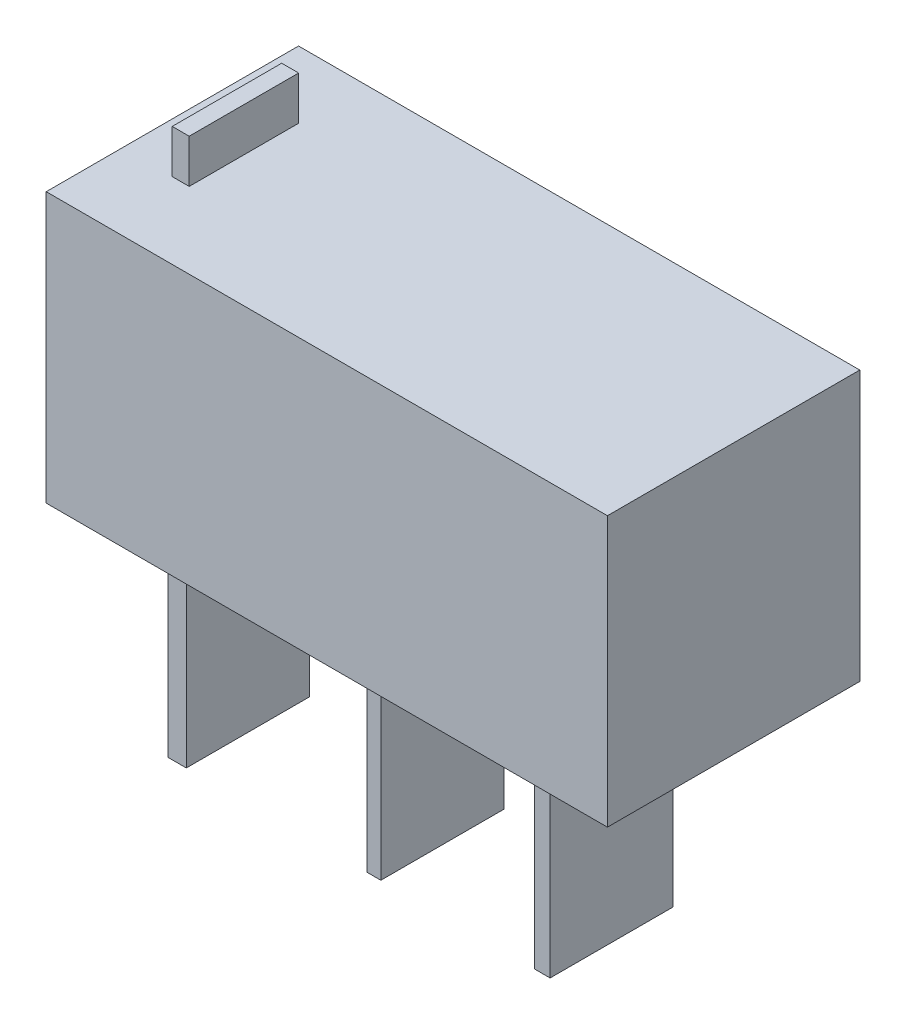
ISO-10303-21;
HEADER;
FILE_DESCRIPTION(('STEP AP214'),'2;1');
FILE_NAME('part.step','',(''),(''),'','','');
FILE_SCHEMA(('AUTOMOTIVE_DESIGN { 1 0 10303 214 1 1 1 1 }'));
ENDSEC;
DATA;
#1=APPLICATION_CONTEXT('core data for automotive mechanical design processes');
#2=APPLICATION_PROTOCOL_DEFINITION('international standard','automotive_design',2000,#1);
#3=PRODUCT_CONTEXT('',#1,'mechanical');
#4=PRODUCT('Part','Part','',(#3));
#5=PRODUCT_RELATED_PRODUCT_CATEGORY('part','',(#4));
#6=PRODUCT_DEFINITION_FORMATION('','',#4);
#7=PRODUCT_DEFINITION_CONTEXT('part definition',#1,'design');
#8=PRODUCT_DEFINITION('design','',#6,#7);
#9=PRODUCT_DEFINITION_SHAPE('','',#8);
#10=(LENGTH_UNIT() NAMED_UNIT(*) SI_UNIT(.MILLI.,.METRE.));
#11=(NAMED_UNIT(*) PLANE_ANGLE_UNIT() SI_UNIT($,.RADIAN.));
#12=(NAMED_UNIT(*) SI_UNIT($,.STERADIAN.) SOLID_ANGLE_UNIT());
#13=UNCERTAINTY_MEASURE_WITH_UNIT(LENGTH_MEASURE(1.E-05),#10,'distance_accuracy_value','');
#14=(GEOMETRIC_REPRESENTATION_CONTEXT(3) GLOBAL_UNCERTAINTY_ASSIGNED_CONTEXT((#13)) GLOBAL_UNIT_ASSIGNED_CONTEXT((#10,
#11,#12)) REPRESENTATION_CONTEXT('',''));
#15=CARTESIAN_POINT('',(0.,0.,0.));
#16=DIRECTION('',(0.,0.,1.));
#17=DIRECTION('',(1.,0.,0.));
#18=AXIS2_PLACEMENT_3D('',#15,#16,#17);
#19=CARTESIAN_POINT('',(0.,0.,0.));
#20=DIRECTION('',(0.,1.,0.));
#21=DIRECTION('',(0.,0.,1.));
#22=AXIS2_PLACEMENT_3D('',#19,#20,#21);
#23=PLANE('',#22);
#24=DIRECTION('',(0.,0.,-1.));
#25=VECTOR('',#24,1.);
#26=CARTESIAN_POINT('',(6.03634542390807,0.,1.63578847152124));
#27=LINE('',#26,#25);
#28=CARTESIAN_POINT('',(6.03634542390807,0.,4.46159278029512));
#29=VERTEX_POINT('',#28);
#30=CARTESIAN_POINT('',(6.03634542390807,0.,1.63578847152124));
#31=VERTEX_POINT('',#30);
#32=EDGE_CURVE('E191',#29,#31,#27,.T.);
#33=ORIENTED_EDGE('',*,*,#32,.F.);
#34=DIRECTION('',(-1.,0.,0.));
#35=VECTOR('',#34,1.);
#36=CARTESIAN_POINT('',(6.03634542390807,0.,4.46159278029512));
#37=LINE('',#36,#35);
#38=CARTESIAN_POINT('',(6.35316918746298,0.,4.46159278029512));
#39=VERTEX_POINT('',#38);
#40=EDGE_CURVE('E204',#39,#29,#37,.T.);
#41=ORIENTED_EDGE('',*,*,#40,.F.);
#42=DIRECTION('',(0.,0.,1.));
#43=VECTOR('',#42,1.);
#44=CARTESIAN_POINT('',(6.35316918746298,0.,1.63578847152124));
#45=LINE('',#44,#43);
#46=CARTESIAN_POINT('',(6.35316918746298,0.,1.63578847152124));
#47=VERTEX_POINT('',#46);
#48=EDGE_CURVE('E213',#47,#39,#45,.T.);
#49=ORIENTED_EDGE('',*,*,#48,.F.);
#50=DIRECTION('',(1.,0.,0.));
#51=VECTOR('',#50,1.);
#52=CARTESIAN_POINT('',(6.03634542390807,0.,1.63578847152124));
#53=LINE('',#52,#51);
#54=EDGE_CURVE('E194',#31,#47,#53,.T.);
#55=ORIENTED_EDGE('',*,*,#54,.F.);
#56=EDGE_LOOP('',(#33,#41,#49,#55));
#57=FACE_BOUND('',#56,.T.);
#58=DIRECTION('',(0.,0.,1.));
#59=VECTOR('',#58,1.);
#60=CARTESIAN_POINT('',(0.,0.,0.));
#61=LINE('',#60,#59);
#62=CARTESIAN_POINT('',(0.,0.,0.));
#63=VERTEX_POINT('',#62);
#64=CARTESIAN_POINT('',(0.,0.,5.8));
#65=VERTEX_POINT('',#64);
#66=EDGE_CURVE('E291',#63,#65,#61,.T.);
#67=ORIENTED_EDGE('',*,*,#66,.F.);
#68=DIRECTION('',(-1.,0.,0.));
#69=VECTOR('',#68,1.);
#70=CARTESIAN_POINT('',(0.,0.,0.));
#71=LINE('',#70,#69);
#72=CARTESIAN_POINT('',(12.9,0.,0.));
#73=VERTEX_POINT('',#72);
#74=EDGE_CURVE('E296',#73,#63,#71,.T.);
#75=ORIENTED_EDGE('',*,*,#74,.F.);
#76=DIRECTION('',(0.,0.,-1.));
#77=VECTOR('',#76,1.);
#78=CARTESIAN_POINT('',(12.9,0.,0.));
#79=LINE('',#78,#77);
#80=CARTESIAN_POINT('',(12.9,0.,5.8));
#81=VERTEX_POINT('',#80);
#82=EDGE_CURVE('E307',#81,#73,#79,.T.);
#83=ORIENTED_EDGE('',*,*,#82,.F.);
#84=DIRECTION('',(1.,0.,0.));
#85=VECTOR('',#84,1.);
#86=CARTESIAN_POINT('',(0.,0.,5.8));
#87=LINE('',#86,#85);
#88=EDGE_CURVE('E305',#65,#81,#87,.T.);
#89=ORIENTED_EDGE('',*,*,#88,.F.);
#90=EDGE_LOOP('',(#67,#75,#83,#89));
#91=FACE_BOUND('',#90,.T.);
#92=DIRECTION('',(0.,0.,-1.));
#93=VECTOR('',#92,1.);
#94=CARTESIAN_POINT('',(1.46413027871972,0.,1.63578847152124));
#95=LINE('',#94,#93);
#96=CARTESIAN_POINT('',(1.46413027871972,0.,4.46159278029512));
#97=VERTEX_POINT('',#96);
#98=CARTESIAN_POINT('',(1.46413027871972,0.,1.63578847152124));
#99=VERTEX_POINT('',#98);
#100=EDGE_CURVE('E229',#97,#99,#95,.T.);
#101=ORIENTED_EDGE('',*,*,#100,.F.);
#102=DIRECTION('',(-1.,0.,0.));
#103=VECTOR('',#102,1.);
#104=CARTESIAN_POINT('',(1.46413027871972,0.,4.46159278029512));
#105=LINE('',#104,#103);
#106=CARTESIAN_POINT('',(1.88198429378872,0.,4.46159278029512));
#107=VERTEX_POINT('',#106);
#108=EDGE_CURVE('E234',#107,#97,#105,.T.);
#109=ORIENTED_EDGE('',*,*,#108,.F.);
#110=DIRECTION('',(0.,0.,1.));
#111=VECTOR('',#110,1.);
#112=CARTESIAN_POINT('',(1.88198429378872,0.,1.63578847152124));
#113=LINE('',#112,#111);
#114=CARTESIAN_POINT('',(1.88198429378872,0.,1.63578847152124));
#115=VERTEX_POINT('',#114);
#116=EDGE_CURVE('E246',#115,#107,#113,.T.);
#117=ORIENTED_EDGE('',*,*,#116,.F.);
#118=DIRECTION('',(1.,0.,0.));
#119=VECTOR('',#118,1.);
#120=CARTESIAN_POINT('',(1.46413027871972,0.,1.63578847152124));
#121=LINE('',#120,#119);
#122=EDGE_CURVE('E243',#99,#115,#121,.T.);
#123=ORIENTED_EDGE('',*,*,#122,.F.);
#124=EDGE_LOOP('',(#101,#109,#117,#123));
#125=FACE_BOUND('',#124,.T.);
#126=DIRECTION('',(0.,0.,-1.));
#127=VECTOR('',#126,1.);
#128=CARTESIAN_POINT('',(9.88671330269142,0.,1.63578847152124));
#129=LINE('',#128,#127);
#130=CARTESIAN_POINT('',(9.88671330269142,0.,4.46159278029512));
#131=VERTEX_POINT('',#130);
#132=CARTESIAN_POINT('',(9.88671330269142,0.,1.63578847152124));
#133=VERTEX_POINT('',#132);
#134=EDGE_CURVE('E190',#131,#133,#129,.T.);
#135=ORIENTED_EDGE('',*,*,#134,.F.);
#136=DIRECTION('',(-1.,0.,0.));
#137=VECTOR('',#136,1.);
#138=CARTESIAN_POINT('',(9.88671330269142,0.,4.46159278029512));
#139=LINE('',#138,#137);
#140=CARTESIAN_POINT('',(10.2436396921348,0.,4.46159278029512));
#141=VERTEX_POINT('',#140);
#142=EDGE_CURVE('E187',#141,#131,#139,.T.);
#143=ORIENTED_EDGE('',*,*,#142,.F.);
#144=DIRECTION('',(0.,0.,1.));
#145=VECTOR('',#144,1.);
#146=CARTESIAN_POINT('',(10.2436396921348,0.,1.63578847152124));
#147=LINE('',#146,#145);
#148=CARTESIAN_POINT('',(10.2436396921348,0.,1.63578847152124));
#149=VERTEX_POINT('',#148);
#150=EDGE_CURVE('E53',#149,#141,#147,.T.);
#151=ORIENTED_EDGE('',*,*,#150,.F.);
#152=DIRECTION('',(1.,0.,0.));
#153=VECTOR('',#152,1.);
#154=CARTESIAN_POINT('',(9.88671330269142,0.,1.63578847152124));
#155=LINE('',#154,#153);
#156=EDGE_CURVE('E48',#133,#149,#155,.T.);
#157=ORIENTED_EDGE('',*,*,#156,.F.);
#158=EDGE_LOOP('',(#135,#143,#151,#157));
#159=FACE_BOUND('',#158,.T.);
#160=ADVANCED_FACE('F33',(#57,#91,#125,#159),#23,.F.);
#161=CARTESIAN_POINT('',(0.,6.2,0.));
#162=DIRECTION('',(0.,1.,0.));
#163=DIRECTION('',(0.,0.,1.));
#164=AXIS2_PLACEMENT_3D('',#161,#162,#163);
#165=PLANE('',#164);
#166=DIRECTION('',(0.,0.,1.));
#167=VECTOR('',#166,1.);
#168=CARTESIAN_POINT('',(0.,6.2,0.));
#169=LINE('',#168,#167);
#170=CARTESIAN_POINT('',(0.,6.2,0.));
#171=VERTEX_POINT('',#170);
#172=CARTESIAN_POINT('',(0.,6.2,5.8));
#173=VERTEX_POINT('',#172);
#174=EDGE_CURVE('E292',#171,#173,#169,.T.);
#175=ORIENTED_EDGE('',*,*,#174,.T.);
#176=DIRECTION('',(1.,0.,0.));
#177=VECTOR('',#176,1.);
#178=CARTESIAN_POINT('',(0.,6.2,5.8));
#179=LINE('',#178,#177);
#180=CARTESIAN_POINT('',(12.9,6.2,5.8));
#181=VERTEX_POINT('',#180);
#182=EDGE_CURVE('E295',#173,#181,#179,.T.);
#183=ORIENTED_EDGE('',*,*,#182,.T.);
#184=DIRECTION('',(0.,0.,-1.));
#185=VECTOR('',#184,1.);
#186=CARTESIAN_POINT('',(12.9,6.2,0.));
#187=LINE('',#186,#185);
#188=CARTESIAN_POINT('',(12.9,6.2,0.));
#189=VERTEX_POINT('',#188);
#190=EDGE_CURVE('E298',#181,#189,#187,.T.);
#191=ORIENTED_EDGE('',*,*,#190,.T.);
#192=DIRECTION('',(-1.,0.,0.));
#193=VECTOR('',#192,1.);
#194=CARTESIAN_POINT('',(0.,6.2,0.));
#195=LINE('',#194,#193);
#196=EDGE_CURVE('E300',#189,#171,#195,.T.);
#197=ORIENTED_EDGE('',*,*,#196,.T.);
#198=EDGE_LOOP('',(#175,#183,#191,#197));
#199=FACE_BOUND('',#198,.T.);
#200=DIRECTION('',(1.,0.,0.));
#201=VECTOR('',#200,1.);
#202=CARTESIAN_POINT('',(1.1486061016388,6.2,4.05212414358402));
#203=LINE('',#202,#201);
#204=CARTESIAN_POINT('',(1.1486061016388,6.2,4.05212414358402));
#205=VERTEX_POINT('',#204);
#206=CARTESIAN_POINT('',(1.53858311466593,6.2,4.05212414358402));
#207=VERTEX_POINT('',#206);
#208=EDGE_CURVE('E276',#205,#207,#203,.T.);
#209=ORIENTED_EDGE('',*,*,#208,.F.);
#210=DIRECTION('',(0.,0.,1.));
#211=VECTOR('',#210,1.);
#212=CARTESIAN_POINT('',(1.1486061016388,6.2,1.53622734069359));
#213=LINE('',#212,#211);
#214=CARTESIAN_POINT('',(1.1486061016388,6.2,1.53622734069359));
#215=VERTEX_POINT('',#214);
#216=EDGE_CURVE('E262',#215,#205,#213,.T.);
#217=ORIENTED_EDGE('',*,*,#216,.F.);
#218=DIRECTION('',(-1.,0.,0.));
#219=VECTOR('',#218,1.);
#220=CARTESIAN_POINT('',(1.1486061016388,6.2,1.53622734069359));
#221=LINE('',#220,#219);
#222=CARTESIAN_POINT('',(1.53858311466593,6.2,1.53622734069359));
#223=VERTEX_POINT('',#222);
#224=EDGE_CURVE('E267',#223,#215,#221,.T.);
#225=ORIENTED_EDGE('',*,*,#224,.F.);
#226=DIRECTION('',(0.,0.,-1.));
#227=VECTOR('',#226,1.);
#228=CARTESIAN_POINT('',(1.53858311466593,6.2,1.53622734069359));
#229=LINE('',#228,#227);
#230=EDGE_CURVE('E278',#207,#223,#229,.T.);
#231=ORIENTED_EDGE('',*,*,#230,.F.);
#232=EDGE_LOOP('',(#209,#217,#225,#231));
#233=FACE_BOUND('',#232,.T.);
#234=ADVANCED_FACE('F334',(#199,#233),#165,.T.);
#235=CARTESIAN_POINT('',(0.,6.2,0.));
#236=DIRECTION('',(1.,0.,0.));
#237=DIRECTION('',(0.,0.,-1.));
#238=AXIS2_PLACEMENT_3D('',#235,#236,#237);
#239=PLANE('',#238);
#240=ORIENTED_EDGE('',*,*,#66,.T.);
#241=DIRECTION('',(0.,-1.,0.));
#242=VECTOR('',#241,1.);
#243=CARTESIAN_POINT('',(0.,6.2,5.8));
#244=LINE('',#243,#242);
#245=EDGE_CURVE('E11',#173,#65,#244,.T.);
#246=ORIENTED_EDGE('',*,*,#245,.F.);
#247=ORIENTED_EDGE('',*,*,#174,.F.);
#248=DIRECTION('',(0.,-1.,0.));
#249=VECTOR('',#248,1.);
#250=CARTESIAN_POINT('',(0.,6.2,0.));
#251=LINE('',#250,#249);
#252=EDGE_CURVE('E302',#171,#63,#251,.T.);
#253=ORIENTED_EDGE('',*,*,#252,.T.);
#254=EDGE_LOOP('',(#240,#246,#247,#253));
#255=FACE_BOUND('',#254,.T.);
#256=ADVANCED_FACE('F35',(#255),#239,.F.);
#257=CARTESIAN_POINT('',(0.,6.2,5.8));
#258=DIRECTION('',(0.,0.,-1.));
#259=DIRECTION('',(-1.,0.,0.));
#260=AXIS2_PLACEMENT_3D('',#257,#258,#259);
#261=PLANE('',#260);
#262=ORIENTED_EDGE('',*,*,#88,.T.);
#263=DIRECTION('',(0.,-1.,0.));
#264=VECTOR('',#263,1.);
#265=CARTESIAN_POINT('',(12.9,6.2,5.8));
#266=LINE('',#265,#264);
#267=EDGE_CURVE('E41',#181,#81,#266,.T.);
#268=ORIENTED_EDGE('',*,*,#267,.F.);
#269=ORIENTED_EDGE('',*,*,#182,.F.);
#270=ORIENTED_EDGE('',*,*,#245,.T.);
#271=EDGE_LOOP('',(#262,#268,#269,#270));
#272=FACE_BOUND('',#271,.T.);
#273=ADVANCED_FACE('F336',(#272),#261,.F.);
#274=CARTESIAN_POINT('',(12.9,6.2,0.));
#275=DIRECTION('',(-1.,0.,0.));
#276=DIRECTION('',(0.,0.,1.));
#277=AXIS2_PLACEMENT_3D('',#274,#275,#276);
#278=PLANE('',#277);
#279=ORIENTED_EDGE('',*,*,#82,.T.);
#280=DIRECTION('',(0.,-1.,0.));
#281=VECTOR('',#280,1.);
#282=CARTESIAN_POINT('',(12.9,6.2,0.));
#283=LINE('',#282,#281);
#284=EDGE_CURVE('E312',#189,#73,#283,.T.);
#285=ORIENTED_EDGE('',*,*,#284,.F.);
#286=ORIENTED_EDGE('',*,*,#190,.F.);
#287=ORIENTED_EDGE('',*,*,#267,.T.);
#288=EDGE_LOOP('',(#279,#285,#286,#287));
#289=FACE_BOUND('',#288,.T.);
#290=ADVANCED_FACE('F319',(#289),#278,.F.);
#291=CARTESIAN_POINT('',(0.,6.2,0.));
#292=DIRECTION('',(0.,0.,1.));
#293=DIRECTION('',(1.,0.,0.));
#294=AXIS2_PLACEMENT_3D('',#291,#292,#293);
#295=PLANE('',#294);
#296=ORIENTED_EDGE('',*,*,#74,.T.);
#297=ORIENTED_EDGE('',*,*,#252,.F.);
#298=ORIENTED_EDGE('',*,*,#196,.F.);
#299=ORIENTED_EDGE('',*,*,#284,.T.);
#300=EDGE_LOOP('',(#296,#297,#298,#299));
#301=FACE_BOUND('',#300,.T.);
#302=ADVANCED_FACE('F328',(#301),#295,.F.);
#303=CARTESIAN_POINT('',(1.1486061016388,7.2,1.53622734069359));
#304=DIRECTION('',(1.,0.,0.));
#305=DIRECTION('',(0.,0.,-1.));
#306=AXIS2_PLACEMENT_3D('',#303,#304,#305);
#307=PLANE('',#306);
#308=ORIENTED_EDGE('',*,*,#216,.T.);
#309=DIRECTION('',(0.,-1.,0.));
#310=VECTOR('',#309,1.);
#311=CARTESIAN_POINT('',(1.1486061016388,7.2,4.05212414358402));
#312=LINE('',#311,#310);
#313=CARTESIAN_POINT('',(1.1486061016388,7.2,4.05212414358402));
#314=VERTEX_POINT('',#313);
#315=EDGE_CURVE('E289',#314,#205,#312,.T.);
#316=ORIENTED_EDGE('',*,*,#315,.F.);
#317=DIRECTION('',(0.,0.,1.));
#318=VECTOR('',#317,1.);
#319=CARTESIAN_POINT('',(1.1486061016388,7.2,1.53622734069359));
#320=LINE('',#319,#318);
#321=CARTESIAN_POINT('',(1.1486061016388,7.2,1.53622734069359));
#322=VERTEX_POINT('',#321);
#323=EDGE_CURVE('E263',#322,#314,#320,.T.);
#324=ORIENTED_EDGE('',*,*,#323,.F.);
#325=DIRECTION('',(0.,-1.,0.));
#326=VECTOR('',#325,1.);
#327=CARTESIAN_POINT('',(1.1486061016388,7.2,1.53622734069359));
#328=LINE('',#327,#326);
#329=EDGE_CURVE('E273',#322,#215,#328,.T.);
#330=ORIENTED_EDGE('',*,*,#329,.T.);
#331=EDGE_LOOP('',(#308,#316,#324,#330));
#332=FACE_BOUND('',#331,.T.);
#333=ADVANCED_FACE('F353',(#332),#307,.F.);
#334=CARTESIAN_POINT('',(1.1486061016388,7.2,4.05212414358402));
#335=DIRECTION('',(0.,0.,-1.));
#336=DIRECTION('',(-1.,0.,0.));
#337=AXIS2_PLACEMENT_3D('',#334,#335,#336);
#338=PLANE('',#337);
#339=ORIENTED_EDGE('',*,*,#208,.T.);
#340=DIRECTION('',(0.,-1.,0.));
#341=VECTOR('',#340,1.);
#342=CARTESIAN_POINT('',(1.53858311466593,7.2,4.05212414358402));
#343=LINE('',#342,#341);
#344=CARTESIAN_POINT('',(1.53858311466593,7.2,4.05212414358402));
#345=VERTEX_POINT('',#344);
#346=EDGE_CURVE('E286',#345,#207,#343,.T.);
#347=ORIENTED_EDGE('',*,*,#346,.F.);
#348=DIRECTION('',(1.,0.,0.));
#349=VECTOR('',#348,1.);
#350=CARTESIAN_POINT('',(1.1486061016388,7.2,4.05212414358402));
#351=LINE('',#350,#349);
#352=EDGE_CURVE('E266',#314,#345,#351,.T.);
#353=ORIENTED_EDGE('',*,*,#352,.F.);
#354=ORIENTED_EDGE('',*,*,#315,.T.);
#355=EDGE_LOOP('',(#339,#347,#353,#354));
#356=FACE_BOUND('',#355,.T.);
#357=ADVANCED_FACE('F357',(#356),#338,.F.);
#358=CARTESIAN_POINT('',(1.53858311466593,7.2,1.53622734069359));
#359=DIRECTION('',(-1.,0.,0.));
#360=DIRECTION('',(0.,0.,1.));
#361=AXIS2_PLACEMENT_3D('',#358,#359,#360);
#362=PLANE('',#361);
#363=ORIENTED_EDGE('',*,*,#230,.T.);
#364=DIRECTION('',(0.,-1.,0.));
#365=VECTOR('',#364,1.);
#366=CARTESIAN_POINT('',(1.53858311466593,7.2,1.53622734069359));
#367=LINE('',#366,#365);
#368=CARTESIAN_POINT('',(1.53858311466593,7.2,1.53622734069359));
#369=VERTEX_POINT('',#368);
#370=EDGE_CURVE('E284',#369,#223,#367,.T.);
#371=ORIENTED_EDGE('',*,*,#370,.F.);
#372=DIRECTION('',(0.,0.,-1.));
#373=VECTOR('',#372,1.);
#374=CARTESIAN_POINT('',(1.53858311466593,7.2,1.53622734069359));
#375=LINE('',#374,#373);
#376=EDGE_CURVE('E269',#345,#369,#375,.T.);
#377=ORIENTED_EDGE('',*,*,#376,.F.);
#378=ORIENTED_EDGE('',*,*,#346,.T.);
#379=EDGE_LOOP('',(#363,#371,#377,#378));
#380=FACE_BOUND('',#379,.T.);
#381=ADVANCED_FACE('F362',(#380),#362,.F.);
#382=CARTESIAN_POINT('',(1.1486061016388,7.2,1.53622734069359));
#383=DIRECTION('',(0.,0.,1.));
#384=DIRECTION('',(1.,0.,0.));
#385=AXIS2_PLACEMENT_3D('',#382,#383,#384);
#386=PLANE('',#385);
#387=ORIENTED_EDGE('',*,*,#224,.T.);
#388=ORIENTED_EDGE('',*,*,#329,.F.);
#389=DIRECTION('',(-1.,0.,0.));
#390=VECTOR('',#389,1.);
#391=CARTESIAN_POINT('',(1.1486061016388,7.2,1.53622734069359));
#392=LINE('',#391,#390);
#393=EDGE_CURVE('E271',#369,#322,#392,.T.);
#394=ORIENTED_EDGE('',*,*,#393,.F.);
#395=ORIENTED_EDGE('',*,*,#370,.T.);
#396=EDGE_LOOP('',(#387,#388,#394,#395));
#397=FACE_BOUND('',#396,.T.);
#398=ADVANCED_FACE('F368',(#397),#386,.F.);
#399=CARTESIAN_POINT('',(0.,7.2,0.));
#400=DIRECTION('',(0.,1.,0.));
#401=DIRECTION('',(0.,0.,1.));
#402=AXIS2_PLACEMENT_3D('',#399,#400,#401);
#403=PLANE('',#402);
#404=ORIENTED_EDGE('',*,*,#323,.T.);
#405=ORIENTED_EDGE('',*,*,#352,.T.);
#406=ORIENTED_EDGE('',*,*,#376,.T.);
#407=ORIENTED_EDGE('',*,*,#393,.T.);
#408=EDGE_LOOP('',(#404,#405,#406,#407));
#409=FACE_BOUND('',#408,.T.);
#410=ADVANCED_FACE('F372',(#409),#403,.T.);
#411=CARTESIAN_POINT('',(1.46413027871972,-5.,1.63578847152124));
#412=DIRECTION('',(1.,0.,0.));
#413=DIRECTION('',(0.,0.,-1.));
#414=AXIS2_PLACEMENT_3D('',#411,#412,#413);
#415=PLANE('',#414);
#416=ORIENTED_EDGE('',*,*,#100,.T.);
#417=DIRECTION('',(0.,1.,0.));
#418=VECTOR('',#417,1.);
#419=CARTESIAN_POINT('',(1.46413027871972,-5.,1.63578847152124));
#420=LINE('',#419,#418);
#421=CARTESIAN_POINT('',(1.46413027871972,-5.,1.63578847152124));
#422=VERTEX_POINT('',#421);
#423=EDGE_CURVE('E259',#422,#99,#420,.T.);
#424=ORIENTED_EDGE('',*,*,#423,.F.);
#425=DIRECTION('',(0.,0.,-1.));
#426=VECTOR('',#425,1.);
#427=CARTESIAN_POINT('',(1.46413027871972,-5.,1.63578847152124));
#428=LINE('',#427,#426);
#429=CARTESIAN_POINT('',(1.46413027871972,-5.,4.46159278029512));
#430=VERTEX_POINT('',#429);
#431=EDGE_CURVE('E230',#430,#422,#428,.T.);
#432=ORIENTED_EDGE('',*,*,#431,.F.);
#433=DIRECTION('',(0.,1.,0.));
#434=VECTOR('',#433,1.);
#435=CARTESIAN_POINT('',(1.46413027871972,-5.,4.46159278029512));
#436=LINE('',#435,#434);
#437=EDGE_CURVE('E240',#430,#97,#436,.T.);
#438=ORIENTED_EDGE('',*,*,#437,.T.);
#439=EDGE_LOOP('',(#416,#424,#432,#438));
#440=FACE_BOUND('',#439,.T.);
#441=ADVANCED_FACE('F376',(#440),#415,.F.);
#442=CARTESIAN_POINT('',(1.46413027871972,-5.,1.63578847152124));
#443=DIRECTION('',(0.,0.,1.));
#444=DIRECTION('',(1.,0.,0.));
#445=AXIS2_PLACEMENT_3D('',#442,#443,#444);
#446=PLANE('',#445);
#447=ORIENTED_EDGE('',*,*,#122,.T.);
#448=DIRECTION('',(0.,1.,0.));
#449=VECTOR('',#448,1.);
#450=CARTESIAN_POINT('',(1.88198429378872,-5.,1.63578847152124));
#451=LINE('',#450,#449);
#452=CARTESIAN_POINT('',(1.88198429378872,-5.,1.63578847152124));
#453=VERTEX_POINT('',#452);
#454=EDGE_CURVE('E256',#453,#115,#451,.T.);
#455=ORIENTED_EDGE('',*,*,#454,.F.);
#456=DIRECTION('',(1.,0.,0.));
#457=VECTOR('',#456,1.);
#458=CARTESIAN_POINT('',(1.46413027871972,-5.,1.63578847152124));
#459=LINE('',#458,#457);
#460=EDGE_CURVE('E233',#422,#453,#459,.T.);
#461=ORIENTED_EDGE('',*,*,#460,.F.);
#462=ORIENTED_EDGE('',*,*,#423,.T.);
#463=EDGE_LOOP('',(#447,#455,#461,#462));
#464=FACE_BOUND('',#463,.T.);
#465=ADVANCED_FACE('F380',(#464),#446,.F.);
#466=CARTESIAN_POINT('',(1.88198429378872,-5.,1.63578847152124));
#467=DIRECTION('',(-1.,0.,0.));
#468=DIRECTION('',(0.,0.,1.));
#469=AXIS2_PLACEMENT_3D('',#466,#467,#468);
#470=PLANE('',#469);
#471=ORIENTED_EDGE('',*,*,#116,.T.);
#472=DIRECTION('',(0.,1.,0.));
#473=VECTOR('',#472,1.);
#474=CARTESIAN_POINT('',(1.88198429378872,-5.,4.46159278029512));
#475=LINE('',#474,#473);
#476=CARTESIAN_POINT('',(1.88198429378872,-5.,4.46159278029512));
#477=VERTEX_POINT('',#476);
#478=EDGE_CURVE('E253',#477,#107,#475,.T.);
#479=ORIENTED_EDGE('',*,*,#478,.F.);
#480=DIRECTION('',(0.,0.,1.));
#481=VECTOR('',#480,1.);
#482=CARTESIAN_POINT('',(1.88198429378872,-5.,1.63578847152124));
#483=LINE('',#482,#481);
#484=EDGE_CURVE('E236',#453,#477,#483,.T.);
#485=ORIENTED_EDGE('',*,*,#484,.F.);
#486=ORIENTED_EDGE('',*,*,#454,.T.);
#487=EDGE_LOOP('',(#471,#479,#485,#486));
#488=FACE_BOUND('',#487,.T.);
#489=ADVANCED_FACE('F384',(#488),#470,.F.);
#490=CARTESIAN_POINT('',(1.46413027871972,-5.,4.46159278029512));
#491=DIRECTION('',(0.,0.,-1.));
#492=DIRECTION('',(-1.,0.,0.));
#493=AXIS2_PLACEMENT_3D('',#490,#491,#492);
#494=PLANE('',#493);
#495=ORIENTED_EDGE('',*,*,#108,.T.);
#496=ORIENTED_EDGE('',*,*,#437,.F.);
#497=DIRECTION('',(-1.,0.,0.));
#498=VECTOR('',#497,1.);
#499=CARTESIAN_POINT('',(1.46413027871972,-5.,4.46159278029512));
#500=LINE('',#499,#498);
#501=EDGE_CURVE('E238',#477,#430,#500,.T.);
#502=ORIENTED_EDGE('',*,*,#501,.F.);
#503=ORIENTED_EDGE('',*,*,#478,.T.);
#504=EDGE_LOOP('',(#495,#496,#502,#503));
#505=FACE_BOUND('',#504,.T.);
#506=ADVANCED_FACE('F388',(#505),#494,.F.);
#507=CARTESIAN_POINT('',(0.,-5.,0.));
#508=DIRECTION('',(0.,1.,0.));
#509=DIRECTION('',(0.,0.,1.));
#510=AXIS2_PLACEMENT_3D('',#507,#508,#509);
#511=PLANE('',#510);
#512=ORIENTED_EDGE('',*,*,#431,.T.);
#513=ORIENTED_EDGE('',*,*,#460,.T.);
#514=ORIENTED_EDGE('',*,*,#484,.T.);
#515=ORIENTED_EDGE('',*,*,#501,.T.);
#516=EDGE_LOOP('',(#512,#513,#514,#515));
#517=FACE_BOUND('',#516,.T.);
#518=ADVANCED_FACE('F392',(#517),#511,.F.);
#519=CARTESIAN_POINT('',(6.03634542390807,-5.,1.63578847152124));
#520=DIRECTION('',(1.,0.,0.));
#521=DIRECTION('',(0.,0.,-1.));
#522=AXIS2_PLACEMENT_3D('',#519,#520,#521);
#523=PLANE('',#522);
#524=ORIENTED_EDGE('',*,*,#32,.T.);
#525=DIRECTION('',(0.,1.,0.));
#526=VECTOR('',#525,1.);
#527=CARTESIAN_POINT('',(6.03634542390807,-5.,1.63578847152124));
#528=LINE('',#527,#526);
#529=CARTESIAN_POINT('',(6.03634542390807,-5.,1.63578847152124));
#530=VERTEX_POINT('',#529);
#531=EDGE_CURVE('E226',#530,#31,#528,.T.);
#532=ORIENTED_EDGE('',*,*,#531,.F.);
#533=DIRECTION('',(0.,0.,-1.));
#534=VECTOR('',#533,1.);
#535=CARTESIAN_POINT('',(6.03634542390807,-5.,1.63578847152124));
#536=LINE('',#535,#534);
#537=CARTESIAN_POINT('',(6.03634542390807,-5.,4.46159278029512));
#538=VERTEX_POINT('',#537);
#539=EDGE_CURVE('E200',#538,#530,#536,.T.);
#540=ORIENTED_EDGE('',*,*,#539,.F.);
#541=DIRECTION('',(0.,1.,0.));
#542=VECTOR('',#541,1.);
#543=CARTESIAN_POINT('',(6.03634542390807,-5.,4.46159278029512));
#544=LINE('',#543,#542);
#545=EDGE_CURVE('E209',#538,#29,#544,.T.);
#546=ORIENTED_EDGE('',*,*,#545,.T.);
#547=EDGE_LOOP('',(#524,#532,#540,#546));
#548=FACE_BOUND('',#547,.T.);
#549=ADVANCED_FACE('F396',(#548),#523,.F.);
#550=CARTESIAN_POINT('',(6.03634542390807,-5.,1.63578847152124));
#551=DIRECTION('',(0.,0.,1.));
#552=DIRECTION('',(1.,0.,0.));
#553=AXIS2_PLACEMENT_3D('',#550,#551,#552);
#554=PLANE('',#553);
#555=ORIENTED_EDGE('',*,*,#54,.T.);
#556=DIRECTION('',(0.,1.,0.));
#557=VECTOR('',#556,1.);
#558=CARTESIAN_POINT('',(6.35316918746298,-5.,1.63578847152124));
#559=LINE('',#558,#557);
#560=CARTESIAN_POINT('',(6.35316918746298,-5.,1.63578847152124));
#561=VERTEX_POINT('',#560);
#562=EDGE_CURVE('E223',#561,#47,#559,.T.);
#563=ORIENTED_EDGE('',*,*,#562,.F.);
#564=DIRECTION('',(1.,0.,0.));
#565=VECTOR('',#564,1.);
#566=CARTESIAN_POINT('',(6.03634542390807,-5.,1.63578847152124));
#567=LINE('',#566,#565);
#568=EDGE_CURVE('E203',#530,#561,#567,.T.);
#569=ORIENTED_EDGE('',*,*,#568,.F.);
#570=ORIENTED_EDGE('',*,*,#531,.T.);
#571=EDGE_LOOP('',(#555,#563,#569,#570));
#572=FACE_BOUND('',#571,.T.);
#573=ADVANCED_FACE('F400',(#572),#554,.F.);
#574=CARTESIAN_POINT('',(6.35316918746298,-5.,1.63578847152124));
#575=DIRECTION('',(-1.,0.,0.));
#576=DIRECTION('',(0.,0.,1.));
#577=AXIS2_PLACEMENT_3D('',#574,#575,#576);
#578=PLANE('',#577);
#579=ORIENTED_EDGE('',*,*,#48,.T.);
#580=DIRECTION('',(0.,1.,0.));
#581=VECTOR('',#580,1.);
#582=CARTESIAN_POINT('',(6.35316918746298,-5.,4.46159278029512));
#583=LINE('',#582,#581);
#584=CARTESIAN_POINT('',(6.35316918746298,-5.,4.46159278029512));
#585=VERTEX_POINT('',#584);
#586=EDGE_CURVE('E220',#585,#39,#583,.T.);
#587=ORIENTED_EDGE('',*,*,#586,.F.);
#588=DIRECTION('',(0.,0.,1.));
#589=VECTOR('',#588,1.);
#590=CARTESIAN_POINT('',(6.35316918746298,-5.,1.63578847152124));
#591=LINE('',#590,#589);
#592=EDGE_CURVE('E206',#561,#585,#591,.T.);
#593=ORIENTED_EDGE('',*,*,#592,.F.);
#594=ORIENTED_EDGE('',*,*,#562,.T.);
#595=EDGE_LOOP('',(#579,#587,#593,#594));
#596=FACE_BOUND('',#595,.T.);
#597=ADVANCED_FACE('F404',(#596),#578,.F.);
#598=CARTESIAN_POINT('',(6.03634542390807,-5.,4.46159278029512));
#599=DIRECTION('',(0.,0.,-1.));
#600=DIRECTION('',(-1.,0.,0.));
#601=AXIS2_PLACEMENT_3D('',#598,#599,#600);
#602=PLANE('',#601);
#603=ORIENTED_EDGE('',*,*,#40,.T.);
#604=ORIENTED_EDGE('',*,*,#545,.F.);
#605=DIRECTION('',(-1.,0.,0.));
#606=VECTOR('',#605,1.);
#607=CARTESIAN_POINT('',(6.03634542390807,-5.,4.46159278029512));
#608=LINE('',#607,#606);
#609=EDGE_CURVE('E208',#585,#538,#608,.T.);
#610=ORIENTED_EDGE('',*,*,#609,.F.);
#611=ORIENTED_EDGE('',*,*,#586,.T.);
#612=EDGE_LOOP('',(#603,#604,#610,#611));
#613=FACE_BOUND('',#612,.T.);
#614=ADVANCED_FACE('F408',(#613),#602,.F.);
#615=CARTESIAN_POINT('',(0.,-5.,0.));
#616=DIRECTION('',(0.,1.,0.));
#617=DIRECTION('',(0.,0.,1.));
#618=AXIS2_PLACEMENT_3D('',#615,#616,#617);
#619=PLANE('',#618);
#620=ORIENTED_EDGE('',*,*,#539,.T.);
#621=ORIENTED_EDGE('',*,*,#568,.T.);
#622=ORIENTED_EDGE('',*,*,#592,.T.);
#623=ORIENTED_EDGE('',*,*,#609,.T.);
#624=EDGE_LOOP('',(#620,#621,#622,#623));
#625=FACE_BOUND('',#624,.T.);
#626=ADVANCED_FACE('F412',(#625),#619,.F.);
#627=CARTESIAN_POINT('',(9.88671330269142,-5.,1.63578847152124));
#628=DIRECTION('',(1.,0.,0.));
#629=DIRECTION('',(0.,0.,-1.));
#630=AXIS2_PLACEMENT_3D('',#627,#628,#629);
#631=PLANE('',#630);
#632=ORIENTED_EDGE('',*,*,#134,.T.);
#633=DIRECTION('',(0.,1.,0.));
#634=VECTOR('',#633,1.);
#635=CARTESIAN_POINT('',(9.88671330269142,-5.,1.63578847152124));
#636=LINE('',#635,#634);
#637=CARTESIAN_POINT('',(9.88671330269142,-5.,1.63578847152124));
#638=VERTEX_POINT('',#637);
#639=EDGE_CURVE('E171',#638,#133,#636,.T.);
#640=ORIENTED_EDGE('',*,*,#639,.F.);
#641=DIRECTION('',(0.,0.,-1.));
#642=VECTOR('',#641,1.);
#643=CARTESIAN_POINT('',(9.88671330269142,-5.,1.63578847152124));
#644=LINE('',#643,#642);
#645=CARTESIAN_POINT('',(9.88671330269142,-5.,4.46159278029512));
#646=VERTEX_POINT('',#645);
#647=EDGE_CURVE('E178',#646,#638,#644,.T.);
#648=ORIENTED_EDGE('',*,*,#647,.F.);
#649=DIRECTION('',(0.,1.,0.));
#650=VECTOR('',#649,1.);
#651=CARTESIAN_POINT('',(9.88671330269142,-5.,4.46159278029512));
#652=LINE('',#651,#650);
#653=EDGE_CURVE('E580',#646,#131,#652,.T.);
#654=ORIENTED_EDGE('',*,*,#653,.T.);
#655=EDGE_LOOP('',(#632,#640,#648,#654));
#656=FACE_BOUND('',#655,.T.);
#657=ADVANCED_FACE('F189',(#656),#631,.F.);
#658=CARTESIAN_POINT('',(9.88671330269142,-5.,1.63578847152124));
#659=DIRECTION('',(0.,0.,1.));
#660=DIRECTION('',(1.,0.,0.));
#661=AXIS2_PLACEMENT_3D('',#658,#659,#660);
#662=PLANE('',#661);
#663=ORIENTED_EDGE('',*,*,#156,.T.);
#664=DIRECTION('',(0.,1.,0.));
#665=VECTOR('',#664,1.);
#666=CARTESIAN_POINT('',(10.2436396921348,-5.,1.63578847152124));
#667=LINE('',#666,#665);
#668=CARTESIAN_POINT('',(10.2436396921348,-5.,1.63578847152124));
#669=VERTEX_POINT('',#668);
#670=EDGE_CURVE('E174',#669,#149,#667,.T.);
#671=ORIENTED_EDGE('',*,*,#670,.F.);
#672=DIRECTION('',(1.,0.,0.));
#673=VECTOR('',#672,1.);
#674=CARTESIAN_POINT('',(9.88671330269142,-5.,1.63578847152124));
#675=LINE('',#674,#673);
#676=EDGE_CURVE('E167',#638,#669,#675,.T.);
#677=ORIENTED_EDGE('',*,*,#676,.F.);
#678=ORIENTED_EDGE('',*,*,#639,.T.);
#679=EDGE_LOOP('',(#663,#671,#677,#678));
#680=FACE_BOUND('',#679,.T.);
#681=ADVANCED_FACE('F169',(#680),#662,.F.);
#682=CARTESIAN_POINT('',(10.2436396921348,-5.,1.63578847152124));
#683=DIRECTION('',(-1.,0.,0.));
#684=DIRECTION('',(0.,0.,1.));
#685=AXIS2_PLACEMENT_3D('',#682,#683,#684);
#686=PLANE('',#685);
#687=ORIENTED_EDGE('',*,*,#150,.T.);
#688=DIRECTION('',(0.,1.,0.));
#689=VECTOR('',#688,1.);
#690=CARTESIAN_POINT('',(10.2436396921348,-5.,4.46159278029512));
#691=LINE('',#690,#689);
#692=CARTESIAN_POINT('',(10.2436396921348,-5.,4.46159278029512));
#693=VERTEX_POINT('',#692);
#694=EDGE_CURVE('E196',#693,#141,#691,.T.);
#695=ORIENTED_EDGE('',*,*,#694,.F.);
#696=DIRECTION('',(0.,0.,1.));
#697=VECTOR('',#696,1.);
#698=CARTESIAN_POINT('',(10.2436396921348,-5.,1.63578847152124));
#699=LINE('',#698,#697);
#700=EDGE_CURVE('E177',#669,#693,#699,.T.);
#701=ORIENTED_EDGE('',*,*,#700,.F.);
#702=ORIENTED_EDGE('',*,*,#670,.T.);
#703=EDGE_LOOP('',(#687,#695,#701,#702));
#704=FACE_BOUND('',#703,.T.);
#705=ADVANCED_FACE('F421',(#704),#686,.F.);
#706=CARTESIAN_POINT('',(9.88671330269142,-5.,4.46159278029512));
#707=DIRECTION('',(0.,0.,-1.));
#708=DIRECTION('',(-1.,0.,0.));
#709=AXIS2_PLACEMENT_3D('',#706,#707,#708);
#710=PLANE('',#709);
#711=ORIENTED_EDGE('',*,*,#142,.T.);
#712=ORIENTED_EDGE('',*,*,#653,.F.);
#713=DIRECTION('',(-1.,0.,0.));
#714=VECTOR('',#713,1.);
#715=CARTESIAN_POINT('',(9.88671330269142,-5.,4.46159278029512));
#716=LINE('',#715,#714);
#717=EDGE_CURVE('E183',#693,#646,#716,.T.);
#718=ORIENTED_EDGE('',*,*,#717,.F.);
#719=ORIENTED_EDGE('',*,*,#694,.T.);
#720=EDGE_LOOP('',(#711,#712,#718,#719));
#721=FACE_BOUND('',#720,.T.);
#722=ADVANCED_FACE('F424',(#721),#710,.F.);
#723=CARTESIAN_POINT('',(0.,-5.,0.));
#724=DIRECTION('',(0.,1.,0.));
#725=DIRECTION('',(0.,0.,1.));
#726=AXIS2_PLACEMENT_3D('',#723,#724,#725);
#727=PLANE('',#726);
#728=ORIENTED_EDGE('',*,*,#647,.T.);
#729=ORIENTED_EDGE('',*,*,#676,.T.);
#730=ORIENTED_EDGE('',*,*,#700,.T.);
#731=ORIENTED_EDGE('',*,*,#717,.T.);
#732=EDGE_LOOP('',(#728,#729,#730,#731));
#733=FACE_BOUND('',#732,.T.);
#734=ADVANCED_FACE('F181',(#733),#727,.F.);
#735=CLOSED_SHELL('',(#160,#234,#256,#273,#290,#302,#333,#357,#381,#398,#410,#441,#465,#489,
#506,#518,#549,#573,#597,#614,#626,#657,#681,#705,#722,#734));
#736=MANIFOLD_SOLID_BREP('B2',#735);
#737=ADVANCED_BREP_SHAPE_REPRESENTATION('',(#18,#736),#14);
#738=SHAPE_DEFINITION_REPRESENTATION(#9,#737);
ENDSEC;
END-ISO-10303-21;
